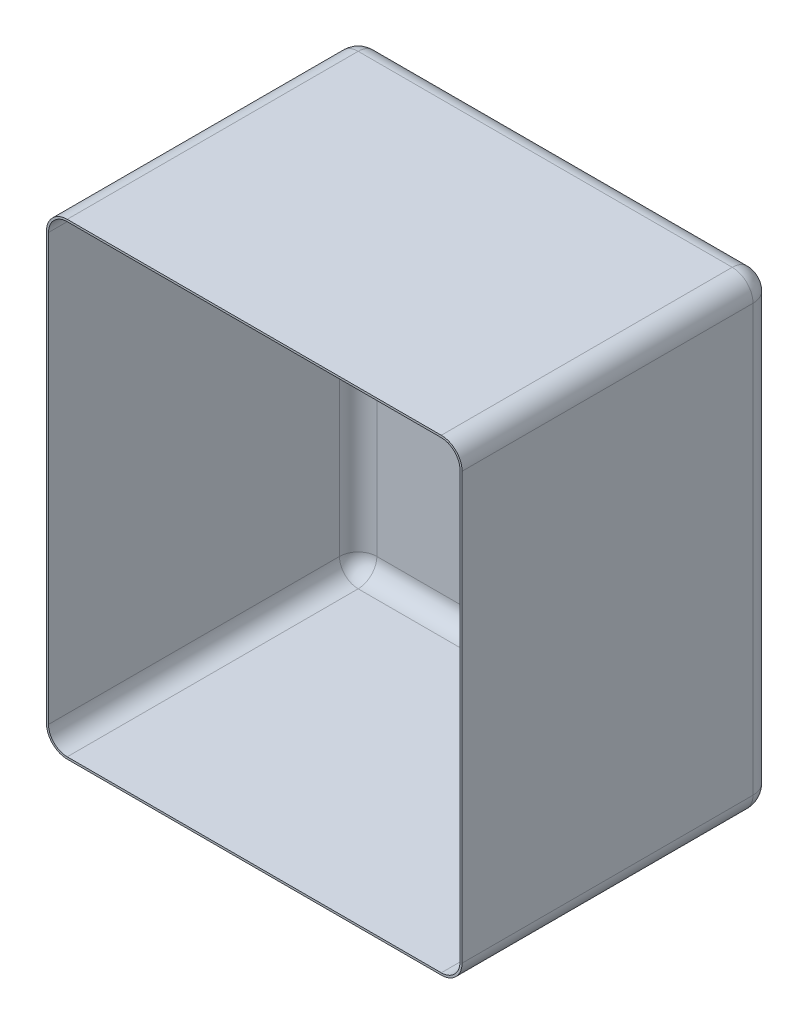
ISO-10303-21;
HEADER;
FILE_DESCRIPTION(('STEP AP214'),'2;1');
FILE_NAME('part.step','',(''),(''),'','','');
FILE_SCHEMA(('AUTOMOTIVE_DESIGN { 1 0 10303 214 1 1 1 1 }'));
ENDSEC;
DATA;
#1=APPLICATION_CONTEXT('core data for automotive mechanical design processes');
#2=APPLICATION_PROTOCOL_DEFINITION('international standard','automotive_design',2000,#1);
#3=PRODUCT_CONTEXT('',#1,'mechanical');
#4=PRODUCT('Part','Part','',(#3));
#5=PRODUCT_RELATED_PRODUCT_CATEGORY('part','',(#4));
#6=PRODUCT_DEFINITION_FORMATION('','',#4);
#7=PRODUCT_DEFINITION_CONTEXT('part definition',#1,'design');
#8=PRODUCT_DEFINITION('design','',#6,#7);
#9=PRODUCT_DEFINITION_SHAPE('','',#8);
#10=(LENGTH_UNIT() NAMED_UNIT(*) SI_UNIT(.MILLI.,.METRE.));
#11=(NAMED_UNIT(*) PLANE_ANGLE_UNIT() SI_UNIT($,.RADIAN.));
#12=(NAMED_UNIT(*) SI_UNIT($,.STERADIAN.) SOLID_ANGLE_UNIT());
#13=UNCERTAINTY_MEASURE_WITH_UNIT(LENGTH_MEASURE(1.E-05),#10,'distance_accuracy_value','');
#14=(GEOMETRIC_REPRESENTATION_CONTEXT(3) GLOBAL_UNCERTAINTY_ASSIGNED_CONTEXT((#13)) GLOBAL_UNIT_ASSIGNED_CONTEXT((#10,
#11,#12)) REPRESENTATION_CONTEXT('',''));
#15=CARTESIAN_POINT('',(0.,0.,0.));
#16=DIRECTION('',(0.,0.,1.));
#17=DIRECTION('',(1.,0.,0.));
#18=AXIS2_PLACEMENT_3D('',#15,#16,#17);
#19=CARTESIAN_POINT('',(200.,225.,300.));
#20=DIRECTION('',(-1.,0.,0.));
#21=DIRECTION('',(0.,-1.,0.));
#22=AXIS2_PLACEMENT_3D('',#19,#20,#21);
#23=PLANE('',#22);
#24=DIRECTION('',(0.,1.,0.));
#25=VECTOR('',#24,1.);
#26=CARTESIAN_POINT('',(200.,225.,20.));
#27=LINE('',#26,#25);
#28=CARTESIAN_POINT('',(200.,-205.,20.));
#29=VERTEX_POINT('',#28);
#30=CARTESIAN_POINT('',(200.,205.,20.));
#31=VERTEX_POINT('',#30);
#32=EDGE_CURVE('E72',#29,#31,#27,.T.);
#33=ORIENTED_EDGE('',*,*,#32,.T.);
#34=DIRECTION('',(0.,0.,-1.));
#35=VECTOR('',#34,1.);
#36=CARTESIAN_POINT('',(200.,205.,300.));
#37=LINE('',#36,#35);
#38=CARTESIAN_POINT('',(200.,205.,300.));
#39=VERTEX_POINT('',#38);
#40=EDGE_CURVE('E296',#31,#39,#37,.F.);
#41=ORIENTED_EDGE('',*,*,#40,.T.);
#42=DIRECTION('',(0.,1.,0.));
#43=VECTOR('',#42,1.);
#44=CARTESIAN_POINT('',(200.,225.,300.));
#45=LINE('',#44,#43);
#46=CARTESIAN_POINT('',(200.,-205.,300.));
#47=VERTEX_POINT('',#46);
#48=EDGE_CURVE('E253',#47,#39,#45,.T.);
#49=ORIENTED_EDGE('',*,*,#48,.F.);
#50=DIRECTION('',(0.,0.,-1.));
#51=VECTOR('',#50,1.);
#52=CARTESIAN_POINT('',(200.,-205.,300.));
#53=LINE('',#52,#51);
#54=EDGE_CURVE('E293',#47,#29,#53,.T.);
#55=ORIENTED_EDGE('',*,*,#54,.T.);
#56=EDGE_LOOP('',(#33,#41,#49,#55));
#57=FACE_BOUND('',#56,.T.);
#58=ADVANCED_FACE('F47',(#57),#23,.F.);
#59=CARTESIAN_POINT('',(-200.,225.,300.));
#60=DIRECTION('',(0.,-1.,0.));
#61=DIRECTION('',(0.,0.,-1.));
#62=AXIS2_PLACEMENT_3D('',#59,#60,#61);
#63=PLANE('',#62);
#64=DIRECTION('',(-1.,0.,0.));
#65=VECTOR('',#64,1.);
#66=CARTESIAN_POINT('',(-200.,225.,20.));
#67=LINE('',#66,#65);
#68=CARTESIAN_POINT('',(180.,225.,20.));
#69=VERTEX_POINT('',#68);
#70=CARTESIAN_POINT('',(-180.,225.,20.));
#71=VERTEX_POINT('',#70);
#72=EDGE_CURVE('E267',#69,#71,#67,.T.);
#73=ORIENTED_EDGE('',*,*,#72,.T.);
#74=DIRECTION('',(0.,0.,-1.));
#75=VECTOR('',#74,1.);
#76=CARTESIAN_POINT('',(-180.,225.,300.));
#77=LINE('',#76,#75);
#78=CARTESIAN_POINT('',(-180.,225.,300.));
#79=VERTEX_POINT('',#78);
#80=EDGE_CURVE('E270',#71,#79,#77,.F.);
#81=ORIENTED_EDGE('',*,*,#80,.T.);
#82=DIRECTION('',(-1.,0.,0.));
#83=VECTOR('',#82,1.);
#84=CARTESIAN_POINT('',(-200.,225.,300.));
#85=LINE('',#84,#83);
#86=CARTESIAN_POINT('',(180.,225.,300.));
#87=VERTEX_POINT('',#86);
#88=EDGE_CURVE('E256',#87,#79,#85,.T.);
#89=ORIENTED_EDGE('',*,*,#88,.F.);
#90=DIRECTION('',(0.,0.,-1.));
#91=VECTOR('',#90,1.);
#92=CARTESIAN_POINT('',(180.,225.,300.));
#93=LINE('',#92,#91);
#94=EDGE_CURVE('E265',#87,#69,#93,.T.);
#95=ORIENTED_EDGE('',*,*,#94,.T.);
#96=EDGE_LOOP('',(#73,#81,#89,#95));
#97=FACE_BOUND('',#96,.T.);
#98=ADVANCED_FACE('F395',(#97),#63,.F.);
#99=CARTESIAN_POINT('',(-200.,225.,300.));
#100=DIRECTION('',(1.,0.,0.));
#101=DIRECTION('',(0.,1.,0.));
#102=AXIS2_PLACEMENT_3D('',#99,#100,#101);
#103=PLANE('',#102);
#104=DIRECTION('',(0.,-1.,0.));
#105=VECTOR('',#104,1.);
#106=CARTESIAN_POINT('',(-200.,225.,300.));
#107=LINE('',#106,#105);
#108=CARTESIAN_POINT('',(-200.,205.,300.));
#109=VERTEX_POINT('',#108);
#110=CARTESIAN_POINT('',(-200.,-205.,300.));
#111=VERTEX_POINT('',#110);
#112=EDGE_CURVE('E259',#109,#111,#107,.T.);
#113=ORIENTED_EDGE('',*,*,#112,.F.);
#114=DIRECTION('',(0.,0.,-1.));
#115=VECTOR('',#114,1.);
#116=CARTESIAN_POINT('',(-200.,205.,300.));
#117=LINE('',#116,#115);
#118=CARTESIAN_POINT('',(-200.,205.,20.));
#119=VERTEX_POINT('',#118);
#120=EDGE_CURVE('E285',#109,#119,#117,.T.);
#121=ORIENTED_EDGE('',*,*,#120,.T.);
#122=DIRECTION('',(0.,-1.,0.));
#123=VECTOR('',#122,1.);
#124=CARTESIAN_POINT('',(-200.,225.,20.));
#125=LINE('',#124,#123);
#126=CARTESIAN_POINT('',(-200.,-205.,20.));
#127=VERTEX_POINT('',#126);
#128=EDGE_CURVE('E283',#119,#127,#125,.T.);
#129=ORIENTED_EDGE('',*,*,#128,.T.);
#130=DIRECTION('',(0.,0.,-1.));
#131=VECTOR('',#130,1.);
#132=CARTESIAN_POINT('',(-200.,-205.,300.));
#133=LINE('',#132,#131);
#134=EDGE_CURVE('E281',#127,#111,#133,.F.);
#135=ORIENTED_EDGE('',*,*,#134,.T.);
#136=EDGE_LOOP('',(#113,#121,#129,#135));
#137=FACE_BOUND('',#136,.T.);
#138=ADVANCED_FACE('F398',(#137),#103,.F.);
#139=CARTESIAN_POINT('',(-200.,-225.,300.));
#140=DIRECTION('',(0.,1.,0.));
#141=DIRECTION('',(0.,0.,1.));
#142=AXIS2_PLACEMENT_3D('',#139,#140,#141);
#143=PLANE('',#142);
#144=DIRECTION('',(1.,0.,0.));
#145=VECTOR('',#144,1.);
#146=CARTESIAN_POINT('',(-200.,-225.,300.));
#147=LINE('',#146,#145);
#148=CARTESIAN_POINT('',(-180.,-225.,300.));
#149=VERTEX_POINT('',#148);
#150=CARTESIAN_POINT('',(180.,-225.,300.));
#151=VERTEX_POINT('',#150);
#152=EDGE_CURVE('E262',#149,#151,#147,.T.);
#153=ORIENTED_EDGE('',*,*,#152,.F.);
#154=DIRECTION('',(0.,0.,-1.));
#155=VECTOR('',#154,1.);
#156=CARTESIAN_POINT('',(-180.,-225.,300.));
#157=LINE('',#156,#155);
#158=CARTESIAN_POINT('',(-180.,-225.,20.));
#159=VERTEX_POINT('',#158);
#160=EDGE_CURVE('E291',#149,#159,#157,.T.);
#161=ORIENTED_EDGE('',*,*,#160,.T.);
#162=DIRECTION('',(1.,0.,0.));
#163=VECTOR('',#162,1.);
#164=CARTESIAN_POINT('',(-200.,-225.,20.));
#165=LINE('',#164,#163);
#166=CARTESIAN_POINT('',(180.,-225.,20.));
#167=VERTEX_POINT('',#166);
#168=EDGE_CURVE('E289',#159,#167,#165,.T.);
#169=ORIENTED_EDGE('',*,*,#168,.T.);
#170=DIRECTION('',(0.,0.,-1.));
#171=VECTOR('',#170,1.);
#172=CARTESIAN_POINT('',(180.,-225.,300.));
#173=LINE('',#172,#171);
#174=EDGE_CURVE('E287',#167,#151,#173,.F.);
#175=ORIENTED_EDGE('',*,*,#174,.T.);
#176=EDGE_LOOP('',(#153,#161,#169,#175));
#177=FACE_BOUND('',#176,.T.);
#178=ADVANCED_FACE('F363',(#177),#143,.F.);
#179=CARTESIAN_POINT('',(0.,0.,300.));
#180=DIRECTION('',(0.,0.,1.));
#181=DIRECTION('',(1.,0.,0.));
#182=AXIS2_PLACEMENT_3D('',#179,#180,#181);
#183=PLANE('',#182);
#184=DIRECTION('',(-1.,0.,0.));
#185=VECTOR('',#184,1.);
#186=CARTESIAN_POINT('',(-200.,223.,300.));
#187=LINE('',#186,#185);
#188=CARTESIAN_POINT('',(180.,223.,300.));
#189=VERTEX_POINT('',#188);
#190=CARTESIAN_POINT('',(-180.,223.,300.));
#191=VERTEX_POINT('',#190);
#192=EDGE_CURVE('E236',#189,#191,#187,.T.);
#193=ORIENTED_EDGE('',*,*,#192,.F.);
#194=CARTESIAN_POINT('',(180.,205.,300.));
#195=DIRECTION('',(0.,0.,1.));
#196=DIRECTION('',(1.,0.,0.));
#197=AXIS2_PLACEMENT_3D('',#194,#195,#196);
#198=CIRCLE('',#197,18.);
#199=CARTESIAN_POINT('',(198.,205.,300.));
#200=VERTEX_POINT('',#199);
#201=EDGE_CURVE('E238',#200,#189,#198,.T.);
#202=ORIENTED_EDGE('',*,*,#201,.F.);
#203=DIRECTION('',(0.,1.,0.));
#204=VECTOR('',#203,1.);
#205=CARTESIAN_POINT('',(198.,225.,300.));
#206=LINE('',#205,#204);
#207=CARTESIAN_POINT('',(198.,-205.,300.));
#208=VERTEX_POINT('',#207);
#209=EDGE_CURVE('E64',#208,#200,#206,.T.);
#210=ORIENTED_EDGE('',*,*,#209,.F.);
#211=CARTESIAN_POINT('',(180.,-205.,300.));
#212=DIRECTION('',(0.,0.,1.));
#213=DIRECTION('',(1.,0.,0.));
#214=AXIS2_PLACEMENT_3D('',#211,#212,#213);
#215=CIRCLE('',#214,18.);
#216=CARTESIAN_POINT('',(180.,-223.,300.));
#217=VERTEX_POINT('',#216);
#218=EDGE_CURVE('E202',#217,#208,#215,.T.);
#219=ORIENTED_EDGE('',*,*,#218,.F.);
#220=DIRECTION('',(1.,0.,0.));
#221=VECTOR('',#220,1.);
#222=CARTESIAN_POINT('',(-200.,-223.,300.));
#223=LINE('',#222,#221);
#224=CARTESIAN_POINT('',(-180.,-223.,300.));
#225=VERTEX_POINT('',#224);
#226=EDGE_CURVE('E224',#225,#217,#223,.T.);
#227=ORIENTED_EDGE('',*,*,#226,.F.);
#228=CARTESIAN_POINT('',(-180.,-205.,300.));
#229=DIRECTION('',(0.,0.,1.));
#230=DIRECTION('',(1.,0.,0.));
#231=AXIS2_PLACEMENT_3D('',#228,#229,#230);
#232=CIRCLE('',#231,18.);
#233=CARTESIAN_POINT('',(-198.,-205.,300.));
#234=VERTEX_POINT('',#233);
#235=EDGE_CURVE('E240',#234,#225,#232,.T.);
#236=ORIENTED_EDGE('',*,*,#235,.F.);
#237=DIRECTION('',(0.,-1.,0.));
#238=VECTOR('',#237,1.);
#239=CARTESIAN_POINT('',(-198.,225.,300.));
#240=LINE('',#239,#238);
#241=CARTESIAN_POINT('',(-198.,205.,300.));
#242=VERTEX_POINT('',#241);
#243=EDGE_CURVE('E243',#242,#234,#240,.T.);
#244=ORIENTED_EDGE('',*,*,#243,.F.);
#245=CARTESIAN_POINT('',(-180.,205.,300.));
#246=DIRECTION('',(0.,0.,1.));
#247=DIRECTION('',(1.,0.,0.));
#248=AXIS2_PLACEMENT_3D('',#245,#246,#247);
#249=CIRCLE('',#248,18.);
#250=EDGE_CURVE('E244',#191,#242,#249,.T.);
#251=ORIENTED_EDGE('',*,*,#250,.F.);
#252=EDGE_LOOP('',(#193,#202,#210,#219,#227,#236,#244,#251));
#253=FACE_BOUND('',#252,.T.);
#254=ORIENTED_EDGE('',*,*,#88,.T.);
#255=CARTESIAN_POINT('',(-180.,205.,300.));
#256=DIRECTION('',(0.,0.,1.));
#257=DIRECTION('',(1.,0.,0.));
#258=AXIS2_PLACEMENT_3D('',#255,#256,#257);
#259=CIRCLE('',#258,20.);
#260=EDGE_CURVE('E11',#79,#109,#259,.T.);
#261=ORIENTED_EDGE('',*,*,#260,.T.);
#262=ORIENTED_EDGE('',*,*,#112,.T.);
#263=CARTESIAN_POINT('',(-180.,-205.,300.));
#264=DIRECTION('',(0.,0.,1.));
#265=DIRECTION('',(1.,0.,0.));
#266=AXIS2_PLACEMENT_3D('',#263,#264,#265);
#267=CIRCLE('',#266,20.);
#268=EDGE_CURVE('E56',#111,#149,#267,.T.);
#269=ORIENTED_EDGE('',*,*,#268,.T.);
#270=ORIENTED_EDGE('',*,*,#152,.T.);
#271=CARTESIAN_POINT('',(180.,-205.,300.));
#272=DIRECTION('',(0.,0.,1.));
#273=DIRECTION('',(1.,0.,0.));
#274=AXIS2_PLACEMENT_3D('',#271,#272,#273);
#275=CIRCLE('',#274,20.);
#276=EDGE_CURVE('E298',#151,#47,#275,.T.);
#277=ORIENTED_EDGE('',*,*,#276,.T.);
#278=ORIENTED_EDGE('',*,*,#48,.T.);
#279=CARTESIAN_POINT('',(180.,205.,300.));
#280=DIRECTION('',(0.,0.,1.));
#281=DIRECTION('',(1.,0.,0.));
#282=AXIS2_PLACEMENT_3D('',#279,#280,#281);
#283=CIRCLE('',#282,20.);
#284=EDGE_CURVE('E300',#39,#87,#283,.T.);
#285=ORIENTED_EDGE('',*,*,#284,.T.);
#286=EDGE_LOOP('',(#254,#261,#262,#269,#270,#277,#278,#285));
#287=FACE_BOUND('',#286,.T.);
#288=ADVANCED_FACE('F356',(#253,#287),#183,.T.);
#289=CARTESIAN_POINT('',(0.,0.,0.));
#290=DIRECTION('',(0.,0.,1.));
#291=DIRECTION('',(1.,0.,0.));
#292=AXIS2_PLACEMENT_3D('',#289,#290,#291);
#293=PLANE('',#292);
#294=DIRECTION('',(0.,-1.,0.));
#295=VECTOR('',#294,1.);
#296=CARTESIAN_POINT('',(-180.,0.,0.));
#297=LINE('',#296,#295);
#298=CARTESIAN_POINT('',(-180.,-205.,0.));
#299=VERTEX_POINT('',#298);
#300=CARTESIAN_POINT('',(-180.,205.,0.));
#301=VERTEX_POINT('',#300);
#302=EDGE_CURVE('E276',#299,#301,#297,.F.);
#303=ORIENTED_EDGE('',*,*,#302,.T.);
#304=DIRECTION('',(-1.,0.,0.));
#305=VECTOR('',#304,1.);
#306=CARTESIAN_POINT('',(0.,205.,0.));
#307=LINE('',#306,#305);
#308=CARTESIAN_POINT('',(180.,205.,0.));
#309=VERTEX_POINT('',#308);
#310=EDGE_CURVE('E278',#301,#309,#307,.F.);
#311=ORIENTED_EDGE('',*,*,#310,.T.);
#312=DIRECTION('',(0.,1.,0.));
#313=VECTOR('',#312,1.);
#314=CARTESIAN_POINT('',(180.,0.,0.));
#315=LINE('',#314,#313);
#316=CARTESIAN_POINT('',(180.,-205.,0.));
#317=VERTEX_POINT('',#316);
#318=EDGE_CURVE('E272',#309,#317,#315,.F.);
#319=ORIENTED_EDGE('',*,*,#318,.T.);
#320=DIRECTION('',(1.,0.,0.));
#321=VECTOR('',#320,1.);
#322=CARTESIAN_POINT('',(0.,-205.,0.));
#323=LINE('',#322,#321);
#324=EDGE_CURVE('E274',#317,#299,#323,.F.);
#325=ORIENTED_EDGE('',*,*,#324,.T.);
#326=EDGE_LOOP('',(#303,#311,#319,#325));
#327=FACE_BOUND('',#326,.T.);
#328=ADVANCED_FACE('F382',(#327),#293,.F.);
#329=CARTESIAN_POINT('',(180.,-205.,300.));
#330=DIRECTION('',(0.,0.,-1.));
#331=DIRECTION('',(-1.,0.,0.));
#332=AXIS2_PLACEMENT_3D('',#329,#330,#331);
#333=CYLINDRICAL_SURFACE('',#332,20.);
#334=ORIENTED_EDGE('',*,*,#276,.F.);
#335=ORIENTED_EDGE('',*,*,#174,.F.);
#336=CARTESIAN_POINT('',(180.,-205.,20.));
#337=DIRECTION('',(0.,0.,-1.));
#338=DIRECTION('',(-1.,0.,0.));
#339=AXIS2_PLACEMENT_3D('',#336,#337,#338);
#340=CIRCLE('',#339,20.);
#341=EDGE_CURVE('E329',#29,#167,#340,.T.);
#342=ORIENTED_EDGE('',*,*,#341,.F.);
#343=ORIENTED_EDGE('',*,*,#54,.F.);
#344=EDGE_LOOP('',(#334,#335,#342,#343));
#345=FACE_BOUND('',#344,.T.);
#346=ADVANCED_FACE('F49',(#345),#333,.T.);
#347=CARTESIAN_POINT('',(-180.,-205.,300.));
#348=DIRECTION('',(0.,0.,-1.));
#349=DIRECTION('',(-1.,0.,0.));
#350=AXIS2_PLACEMENT_3D('',#347,#348,#349);
#351=CYLINDRICAL_SURFACE('',#350,20.);
#352=ORIENTED_EDGE('',*,*,#268,.F.);
#353=ORIENTED_EDGE('',*,*,#134,.F.);
#354=CARTESIAN_POINT('',(-180.,-205.,20.));
#355=DIRECTION('',(0.,0.,-1.));
#356=DIRECTION('',(-1.,0.,0.));
#357=AXIS2_PLACEMENT_3D('',#354,#355,#356);
#358=CIRCLE('',#357,20.);
#359=EDGE_CURVE('E327',#159,#127,#358,.T.);
#360=ORIENTED_EDGE('',*,*,#359,.F.);
#361=ORIENTED_EDGE('',*,*,#160,.F.);
#362=EDGE_LOOP('',(#352,#353,#360,#361));
#363=FACE_BOUND('',#362,.T.);
#364=ADVANCED_FACE('F372',(#363),#351,.T.);
#365=CARTESIAN_POINT('',(-200.,-205.,20.));
#366=DIRECTION('',(1.,0.,0.));
#367=DIRECTION('',(0.,0.,-1.));
#368=AXIS2_PLACEMENT_3D('',#365,#366,#367);
#369=CYLINDRICAL_SURFACE('',#368,20.);
#370=CARTESIAN_POINT('',(180.,-205.,20.));
#371=DIRECTION('',(1.,0.,0.));
#372=DIRECTION('',(0.,0.,-1.));
#373=AXIS2_PLACEMENT_3D('',#370,#371,#372);
#374=CIRCLE('',#373,20.);
#375=EDGE_CURVE('E51',#167,#317,#374,.T.);
#376=ORIENTED_EDGE('',*,*,#375,.F.);
#377=ORIENTED_EDGE('',*,*,#168,.F.);
#378=CARTESIAN_POINT('',(-180.,-205.,20.));
#379=DIRECTION('',(-1.,0.,0.));
#380=DIRECTION('',(0.,0.,1.));
#381=AXIS2_PLACEMENT_3D('',#378,#379,#380);
#382=CIRCLE('',#381,20.);
#383=EDGE_CURVE('E324',#299,#159,#382,.T.);
#384=ORIENTED_EDGE('',*,*,#383,.F.);
#385=ORIENTED_EDGE('',*,*,#324,.F.);
#386=EDGE_LOOP('',(#376,#377,#384,#385));
#387=FACE_BOUND('',#386,.T.);
#388=ADVANCED_FACE('F367',(#387),#369,.T.);
#389=CARTESIAN_POINT('',(180.,-205.,20.));
#390=DIRECTION('',(0.,0.,1.));
#391=DIRECTION('',(1.,0.,0.));
#392=AXIS2_PLACEMENT_3D('',#389,#390,#391);
#393=SPHERICAL_SURFACE('',#392,20.);
#394=ORIENTED_EDGE('',*,*,#341,.T.);
#395=ORIENTED_EDGE('',*,*,#375,.T.);
#396=CARTESIAN_POINT('',(180.,-205.,20.));
#397=DIRECTION('',(0.,-1.,0.));
#398=DIRECTION('',(1.,0.,0.));
#399=AXIS2_PLACEMENT_3D('',#396,#397,#398);
#400=CIRCLE('',#399,20.);
#401=EDGE_CURVE('E321',#29,#317,#400,.F.);
#402=ORIENTED_EDGE('',*,*,#401,.F.);
#403=EDGE_LOOP('',(#394,#395,#402));
#404=FACE_BOUND('',#403,.T.);
#405=ADVANCED_FACE('F336',(#404),#393,.T.);
#406=CARTESIAN_POINT('',(-180.,-205.,20.));
#407=DIRECTION('',(0.,0.,1.));
#408=DIRECTION('',(1.,0.,0.));
#409=AXIS2_PLACEMENT_3D('',#406,#407,#408);
#410=SPHERICAL_SURFACE('',#409,20.);
#411=ORIENTED_EDGE('',*,*,#383,.T.);
#412=ORIENTED_EDGE('',*,*,#359,.T.);
#413=CARTESIAN_POINT('',(-180.,-205.,20.));
#414=DIRECTION('',(0.,-1.,0.));
#415=DIRECTION('',(0.,0.,-1.));
#416=AXIS2_PLACEMENT_3D('',#413,#414,#415);
#417=CIRCLE('',#416,20.);
#418=EDGE_CURVE('E318',#299,#127,#417,.F.);
#419=ORIENTED_EDGE('',*,*,#418,.F.);
#420=EDGE_LOOP('',(#411,#412,#419));
#421=FACE_BOUND('',#420,.T.);
#422=ADVANCED_FACE('F374',(#421),#410,.T.);
#423=CARTESIAN_POINT('',(180.,225.,20.));
#424=DIRECTION('',(0.,1.,0.));
#425=DIRECTION('',(-1.,0.,0.));
#426=AXIS2_PLACEMENT_3D('',#423,#424,#425);
#427=CYLINDRICAL_SURFACE('',#426,20.);
#428=ORIENTED_EDGE('',*,*,#401,.T.);
#429=ORIENTED_EDGE('',*,*,#318,.F.);
#430=CARTESIAN_POINT('',(180.,205.,20.));
#431=DIRECTION('',(0.,1.,0.));
#432=DIRECTION('',(0.,0.,1.));
#433=AXIS2_PLACEMENT_3D('',#430,#431,#432);
#434=CIRCLE('',#433,20.);
#435=EDGE_CURVE('E315',#31,#309,#434,.T.);
#436=ORIENTED_EDGE('',*,*,#435,.F.);
#437=ORIENTED_EDGE('',*,*,#32,.F.);
#438=EDGE_LOOP('',(#428,#429,#436,#437));
#439=FACE_BOUND('',#438,.T.);
#440=ADVANCED_FACE('F342',(#439),#427,.T.);
#441=CARTESIAN_POINT('',(180.,205.,300.));
#442=DIRECTION('',(0.,0.,-1.));
#443=DIRECTION('',(-1.,0.,0.));
#444=AXIS2_PLACEMENT_3D('',#441,#442,#443);
#445=CYLINDRICAL_SURFACE('',#444,20.);
#446=ORIENTED_EDGE('',*,*,#284,.F.);
#447=ORIENTED_EDGE('',*,*,#40,.F.);
#448=CARTESIAN_POINT('',(180.,205.,20.));
#449=DIRECTION('',(0.,0.,-1.));
#450=DIRECTION('',(-1.,0.,0.));
#451=AXIS2_PLACEMENT_3D('',#448,#449,#450);
#452=CIRCLE('',#451,20.);
#453=EDGE_CURVE('E312',#69,#31,#452,.T.);
#454=ORIENTED_EDGE('',*,*,#453,.F.);
#455=ORIENTED_EDGE('',*,*,#94,.F.);
#456=EDGE_LOOP('',(#446,#447,#454,#455));
#457=FACE_BOUND('',#456,.T.);
#458=ADVANCED_FACE('F352',(#457),#445,.T.);
#459=CARTESIAN_POINT('',(-180.,205.,300.));
#460=DIRECTION('',(0.,0.,-1.));
#461=DIRECTION('',(-1.,0.,0.));
#462=AXIS2_PLACEMENT_3D('',#459,#460,#461);
#463=CYLINDRICAL_SURFACE('',#462,20.);
#464=ORIENTED_EDGE('',*,*,#260,.F.);
#465=ORIENTED_EDGE('',*,*,#80,.F.);
#466=CARTESIAN_POINT('',(-180.,205.,20.));
#467=DIRECTION('',(0.,0.,-1.));
#468=DIRECTION('',(-1.,0.,0.));
#469=AXIS2_PLACEMENT_3D('',#466,#467,#468);
#470=CIRCLE('',#469,20.);
#471=EDGE_CURVE('E309',#119,#71,#470,.T.);
#472=ORIENTED_EDGE('',*,*,#471,.F.);
#473=ORIENTED_EDGE('',*,*,#120,.F.);
#474=EDGE_LOOP('',(#464,#465,#472,#473));
#475=FACE_BOUND('',#474,.T.);
#476=ADVANCED_FACE('F393',(#475),#463,.T.);
#477=CARTESIAN_POINT('',(-180.,225.,20.));
#478=DIRECTION('',(0.,-1.,0.));
#479=DIRECTION('',(1.,0.,0.));
#480=AXIS2_PLACEMENT_3D('',#477,#478,#479);
#481=CYLINDRICAL_SURFACE('',#480,20.);
#482=ORIENTED_EDGE('',*,*,#418,.T.);
#483=ORIENTED_EDGE('',*,*,#128,.F.);
#484=CARTESIAN_POINT('',(-180.,205.,20.));
#485=DIRECTION('',(0.,1.,0.));
#486=DIRECTION('',(0.,0.,1.));
#487=AXIS2_PLACEMENT_3D('',#484,#485,#486);
#488=CIRCLE('',#487,20.);
#489=EDGE_CURVE('E306',#301,#119,#488,.T.);
#490=ORIENTED_EDGE('',*,*,#489,.F.);
#491=ORIENTED_EDGE('',*,*,#302,.F.);
#492=EDGE_LOOP('',(#482,#483,#490,#491));
#493=FACE_BOUND('',#492,.T.);
#494=ADVANCED_FACE('F379',(#493),#481,.T.);
#495=CARTESIAN_POINT('',(180.,205.,20.));
#496=DIRECTION('',(0.,0.,1.));
#497=DIRECTION('',(1.,0.,0.));
#498=AXIS2_PLACEMENT_3D('',#495,#496,#497);
#499=SPHERICAL_SURFACE('',#498,20.);
#500=ORIENTED_EDGE('',*,*,#453,.T.);
#501=ORIENTED_EDGE('',*,*,#435,.T.);
#502=CARTESIAN_POINT('',(180.,205.,20.));
#503=DIRECTION('',(1.,0.,0.));
#504=DIRECTION('',(0.,1.,0.));
#505=AXIS2_PLACEMENT_3D('',#502,#503,#504);
#506=CIRCLE('',#505,20.);
#507=EDGE_CURVE('E304',#69,#309,#506,.F.);
#508=ORIENTED_EDGE('',*,*,#507,.F.);
#509=EDGE_LOOP('',(#500,#501,#508));
#510=FACE_BOUND('',#509,.T.);
#511=ADVANCED_FACE('F347',(#510),#499,.T.);
#512=CARTESIAN_POINT('',(-180.,205.,20.));
#513=DIRECTION('',(0.,0.,1.));
#514=DIRECTION('',(1.,0.,0.));
#515=AXIS2_PLACEMENT_3D('',#512,#513,#514);
#516=SPHERICAL_SURFACE('',#515,20.);
#517=ORIENTED_EDGE('',*,*,#489,.T.);
#518=ORIENTED_EDGE('',*,*,#471,.T.);
#519=CARTESIAN_POINT('',(-180.,205.,20.));
#520=DIRECTION('',(-1.,0.,0.));
#521=DIRECTION('',(0.,0.,1.));
#522=AXIS2_PLACEMENT_3D('',#519,#520,#521);
#523=CIRCLE('',#522,20.);
#524=EDGE_CURVE('E246',#301,#71,#523,.F.);
#525=ORIENTED_EDGE('',*,*,#524,.F.);
#526=EDGE_LOOP('',(#517,#518,#525));
#527=FACE_BOUND('',#526,.T.);
#528=ADVANCED_FACE('F387',(#527),#516,.T.);
#529=CARTESIAN_POINT('',(-200.,205.,20.));
#530=DIRECTION('',(-1.,0.,0.));
#531=DIRECTION('',(0.,0.,1.));
#532=AXIS2_PLACEMENT_3D('',#529,#530,#531);
#533=CYLINDRICAL_SURFACE('',#532,20.);
#534=ORIENTED_EDGE('',*,*,#507,.T.);
#535=ORIENTED_EDGE('',*,*,#310,.F.);
#536=ORIENTED_EDGE('',*,*,#524,.T.);
#537=ORIENTED_EDGE('',*,*,#72,.F.);
#538=EDGE_LOOP('',(#534,#535,#536,#537));
#539=FACE_BOUND('',#538,.T.);
#540=ADVANCED_FACE('F385',(#539),#533,.T.);
#541=CARTESIAN_POINT('',(198.,225.,300.));
#542=DIRECTION('',(-1.,0.,0.));
#543=DIRECTION('',(0.,-1.,0.));
#544=AXIS2_PLACEMENT_3D('',#541,#542,#543);
#545=PLANE('',#544);
#546=DIRECTION('',(0.,-1.,0.));
#547=VECTOR('',#546,1.);
#548=CARTESIAN_POINT('',(198.,225.,20.));
#549=LINE('',#548,#547);
#550=CARTESIAN_POINT('',(198.,-205.,20.));
#551=VERTEX_POINT('',#550);
#552=CARTESIAN_POINT('',(198.,205.,20.));
#553=VERTEX_POINT('',#552);
#554=EDGE_CURVE('E188',#551,#553,#549,.F.);
#555=ORIENTED_EDGE('',*,*,#554,.F.);
#556=DIRECTION('',(0.,0.,1.));
#557=VECTOR('',#556,1.);
#558=CARTESIAN_POINT('',(198.,-205.,300.));
#559=LINE('',#558,#557);
#560=EDGE_CURVE('E196',#208,#551,#559,.F.);
#561=ORIENTED_EDGE('',*,*,#560,.F.);
#562=ORIENTED_EDGE('',*,*,#209,.T.);
#563=DIRECTION('',(0.,0.,1.));
#564=VECTOR('',#563,1.);
#565=CARTESIAN_POINT('',(198.,205.,300.));
#566=LINE('',#565,#564);
#567=EDGE_CURVE('E195',#553,#200,#566,.T.);
#568=ORIENTED_EDGE('',*,*,#567,.F.);
#569=EDGE_LOOP('',(#555,#561,#562,#568));
#570=FACE_BOUND('',#569,.T.);
#571=ADVANCED_FACE('F198',(#570),#545,.T.);
#572=CARTESIAN_POINT('',(-200.,223.,300.));
#573=DIRECTION('',(0.,-1.,0.));
#574=DIRECTION('',(0.,0.,-1.));
#575=AXIS2_PLACEMENT_3D('',#572,#573,#574);
#576=PLANE('',#575);
#577=DIRECTION('',(1.,0.,0.));
#578=VECTOR('',#577,1.);
#579=CARTESIAN_POINT('',(-200.,223.,20.));
#580=LINE('',#579,#578);
#581=CARTESIAN_POINT('',(180.,223.,20.));
#582=VERTEX_POINT('',#581);
#583=CARTESIAN_POINT('',(-180.,223.,20.));
#584=VERTEX_POINT('',#583);
#585=EDGE_CURVE('E223',#582,#584,#580,.F.);
#586=ORIENTED_EDGE('',*,*,#585,.F.);
#587=DIRECTION('',(0.,0.,-1.));
#588=VECTOR('',#587,1.);
#589=CARTESIAN_POINT('',(180.,223.,300.));
#590=LINE('',#589,#588);
#591=EDGE_CURVE('E214',#189,#582,#590,.T.);
#592=ORIENTED_EDGE('',*,*,#591,.F.);
#593=ORIENTED_EDGE('',*,*,#192,.T.);
#594=DIRECTION('',(0.,0.,-1.));
#595=VECTOR('',#594,1.);
#596=CARTESIAN_POINT('',(-180.,223.,300.));
#597=LINE('',#596,#595);
#598=EDGE_CURVE('E227',#584,#191,#597,.F.);
#599=ORIENTED_EDGE('',*,*,#598,.F.);
#600=EDGE_LOOP('',(#586,#592,#593,#599));
#601=FACE_BOUND('',#600,.T.);
#602=ADVANCED_FACE('F498',(#601),#576,.T.);
#603=CARTESIAN_POINT('',(-198.,225.,300.));
#604=DIRECTION('',(1.,0.,0.));
#605=DIRECTION('',(0.,1.,0.));
#606=AXIS2_PLACEMENT_3D('',#603,#604,#605);
#607=PLANE('',#606);
#608=ORIENTED_EDGE('',*,*,#243,.T.);
#609=DIRECTION('',(0.,0.,1.));
#610=VECTOR('',#609,1.);
#611=CARTESIAN_POINT('',(-198.,-205.,300.));
#612=LINE('',#611,#610);
#613=CARTESIAN_POINT('',(-198.,-205.,20.));
#614=VERTEX_POINT('',#613);
#615=EDGE_CURVE('E732',#614,#234,#612,.T.);
#616=ORIENTED_EDGE('',*,*,#615,.F.);
#617=DIRECTION('',(0.,1.,0.));
#618=VECTOR('',#617,1.);
#619=CARTESIAN_POINT('',(-198.,225.,20.));
#620=LINE('',#619,#618);
#621=CARTESIAN_POINT('',(-198.,205.,20.));
#622=VERTEX_POINT('',#621);
#623=EDGE_CURVE('E735',#622,#614,#620,.F.);
#624=ORIENTED_EDGE('',*,*,#623,.F.);
#625=DIRECTION('',(0.,0.,1.));
#626=VECTOR('',#625,1.);
#627=CARTESIAN_POINT('',(-198.,205.,300.));
#628=LINE('',#627,#626);
#629=EDGE_CURVE('E757',#242,#622,#628,.F.);
#630=ORIENTED_EDGE('',*,*,#629,.F.);
#631=EDGE_LOOP('',(#608,#616,#624,#630));
#632=FACE_BOUND('',#631,.T.);
#633=ADVANCED_FACE('F494',(#632),#607,.T.);
#634=CARTESIAN_POINT('',(-200.,-223.,300.));
#635=DIRECTION('',(0.,1.,0.));
#636=DIRECTION('',(0.,0.,1.));
#637=AXIS2_PLACEMENT_3D('',#634,#635,#636);
#638=PLANE('',#637);
#639=ORIENTED_EDGE('',*,*,#226,.T.);
#640=DIRECTION('',(0.,0.,1.));
#641=VECTOR('',#640,1.);
#642=CARTESIAN_POINT('',(180.,-223.,300.));
#643=LINE('',#642,#641);
#644=CARTESIAN_POINT('',(180.,-223.,20.));
#645=VERTEX_POINT('',#644);
#646=EDGE_CURVE('E759',#645,#217,#643,.T.);
#647=ORIENTED_EDGE('',*,*,#646,.F.);
#648=DIRECTION('',(1.,0.,0.));
#649=VECTOR('',#648,1.);
#650=CARTESIAN_POINT('',(-200.,-223.,20.));
#651=LINE('',#650,#649);
#652=CARTESIAN_POINT('',(-180.,-223.,20.));
#653=VERTEX_POINT('',#652);
#654=EDGE_CURVE('E762',#653,#645,#651,.T.);
#655=ORIENTED_EDGE('',*,*,#654,.F.);
#656=DIRECTION('',(0.,0.,1.));
#657=VECTOR('',#656,1.);
#658=CARTESIAN_POINT('',(-180.,-223.,300.));
#659=LINE('',#658,#657);
#660=EDGE_CURVE('E764',#225,#653,#659,.F.);
#661=ORIENTED_EDGE('',*,*,#660,.F.);
#662=EDGE_LOOP('',(#639,#647,#655,#661));
#663=FACE_BOUND('',#662,.T.);
#664=ADVANCED_FACE('F490',(#663),#638,.T.);
#665=CARTESIAN_POINT('',(0.,0.,2.));
#666=DIRECTION('',(0.,0.,1.));
#667=DIRECTION('',(1.,0.,0.));
#668=AXIS2_PLACEMENT_3D('',#665,#666,#667);
#669=PLANE('',#668);
#670=DIRECTION('',(0.,1.,0.));
#671=VECTOR('',#670,1.);
#672=CARTESIAN_POINT('',(-180.,0.,2.));
#673=LINE('',#672,#671);
#674=CARTESIAN_POINT('',(-180.,-205.,2.));
#675=VERTEX_POINT('',#674);
#676=CARTESIAN_POINT('',(-180.,205.,2.));
#677=VERTEX_POINT('',#676);
#678=EDGE_CURVE('E733',#675,#677,#673,.T.);
#679=ORIENTED_EDGE('',*,*,#678,.F.);
#680=DIRECTION('',(1.,0.,0.));
#681=VECTOR('',#680,1.);
#682=CARTESIAN_POINT('',(0.,-205.,2.));
#683=LINE('',#682,#681);
#684=CARTESIAN_POINT('',(180.,-205.,2.));
#685=VERTEX_POINT('',#684);
#686=EDGE_CURVE('E737',#685,#675,#683,.F.);
#687=ORIENTED_EDGE('',*,*,#686,.F.);
#688=DIRECTION('',(0.,1.,0.));
#689=VECTOR('',#688,1.);
#690=CARTESIAN_POINT('',(180.,0.,2.));
#691=LINE('',#690,#689);
#692=CARTESIAN_POINT('',(180.,205.,2.00000000000002));
#693=VERTEX_POINT('',#692);
#694=EDGE_CURVE('E228',#693,#685,#691,.F.);
#695=ORIENTED_EDGE('',*,*,#694,.F.);
#696=DIRECTION('',(1.,0.,0.));
#697=VECTOR('',#696,1.);
#698=CARTESIAN_POINT('',(0.,205.,2.));
#699=LINE('',#698,#697);
#700=EDGE_CURVE('E730',#677,#693,#699,.T.);
#701=ORIENTED_EDGE('',*,*,#700,.F.);
#702=EDGE_LOOP('',(#679,#687,#695,#701));
#703=FACE_BOUND('',#702,.T.);
#704=ADVANCED_FACE('F486',(#703),#669,.T.);
#705=CARTESIAN_POINT('',(180.,-205.,300.));
#706=DIRECTION('',(0.,0.,-1.));
#707=DIRECTION('',(-1.,0.,0.));
#708=AXIS2_PLACEMENT_3D('',#705,#706,#707);
#709=CYLINDRICAL_SURFACE('',#708,18.);
#710=ORIENTED_EDGE('',*,*,#218,.T.);
#711=ORIENTED_EDGE('',*,*,#560,.T.);
#712=CARTESIAN_POINT('',(180.,-205.,20.));
#713=DIRECTION('',(0.,0.,1.));
#714=DIRECTION('',(1.,0.,0.));
#715=AXIS2_PLACEMENT_3D('',#712,#713,#714);
#716=CIRCLE('',#715,18.);
#717=EDGE_CURVE('E744',#551,#645,#716,.F.);
#718=ORIENTED_EDGE('',*,*,#717,.T.);
#719=ORIENTED_EDGE('',*,*,#646,.T.);
#720=EDGE_LOOP('',(#710,#711,#718,#719));
#721=FACE_BOUND('',#720,.T.);
#722=ADVANCED_FACE('F482',(#721),#709,.F.);
#723=CARTESIAN_POINT('',(-180.,-205.,300.));
#724=DIRECTION('',(0.,0.,-1.));
#725=DIRECTION('',(-1.,0.,0.));
#726=AXIS2_PLACEMENT_3D('',#723,#724,#725);
#727=CYLINDRICAL_SURFACE('',#726,18.);
#728=ORIENTED_EDGE('',*,*,#235,.T.);
#729=ORIENTED_EDGE('',*,*,#660,.T.);
#730=CARTESIAN_POINT('',(-180.,-205.,20.));
#731=DIRECTION('',(0.,0.,1.));
#732=DIRECTION('',(1.,0.,0.));
#733=AXIS2_PLACEMENT_3D('',#730,#731,#732);
#734=CIRCLE('',#733,18.);
#735=EDGE_CURVE('E749',#653,#614,#734,.F.);
#736=ORIENTED_EDGE('',*,*,#735,.T.);
#737=ORIENTED_EDGE('',*,*,#615,.T.);
#738=EDGE_LOOP('',(#728,#729,#736,#737));
#739=FACE_BOUND('',#738,.T.);
#740=ADVANCED_FACE('F478',(#739),#727,.F.);
#741=CARTESIAN_POINT('',(-200.,-205.,20.));
#742=DIRECTION('',(1.,0.,0.));
#743=DIRECTION('',(0.,0.,-1.));
#744=AXIS2_PLACEMENT_3D('',#741,#742,#743);
#745=CYLINDRICAL_SURFACE('',#744,18.);
#746=CARTESIAN_POINT('',(180.,-205.,20.));
#747=DIRECTION('',(-1.,0.,0.));
#748=DIRECTION('',(0.,-1.,0.));
#749=AXIS2_PLACEMENT_3D('',#746,#747,#748);
#750=CIRCLE('',#749,18.);
#751=EDGE_CURVE('E237',#645,#685,#750,.F.);
#752=ORIENTED_EDGE('',*,*,#751,.T.);
#753=ORIENTED_EDGE('',*,*,#686,.T.);
#754=CARTESIAN_POINT('',(-180.,-205.,20.));
#755=DIRECTION('',(-1.,0.,0.));
#756=DIRECTION('',(0.,-1.,0.));
#757=AXIS2_PLACEMENT_3D('',#754,#755,#756);
#758=CIRCLE('',#757,18.);
#759=EDGE_CURVE('E745',#675,#653,#758,.T.);
#760=ORIENTED_EDGE('',*,*,#759,.T.);
#761=ORIENTED_EDGE('',*,*,#654,.T.);
#762=EDGE_LOOP('',(#752,#753,#760,#761));
#763=FACE_BOUND('',#762,.T.);
#764=ADVANCED_FACE('F474',(#763),#745,.F.);
#765=CARTESIAN_POINT('',(180.,-205.,20.));
#766=DIRECTION('',(0.,0.,1.));
#767=DIRECTION('',(1.,0.,0.));
#768=AXIS2_PLACEMENT_3D('',#765,#766,#767);
#769=SPHERICAL_SURFACE('',#768,18.);
#770=ORIENTED_EDGE('',*,*,#717,.F.);
#771=CARTESIAN_POINT('',(180.,-205.,20.));
#772=DIRECTION('',(0.,1.,0.));
#773=DIRECTION('',(-1.,0.,0.));
#774=AXIS2_PLACEMENT_3D('',#771,#772,#773);
#775=CIRCLE('',#774,18.);
#776=EDGE_CURVE('E194',#551,#685,#775,.T.);
#777=ORIENTED_EDGE('',*,*,#776,.T.);
#778=ORIENTED_EDGE('',*,*,#751,.F.);
#779=EDGE_LOOP('',(#770,#777,#778));
#780=FACE_BOUND('',#779,.T.);
#781=ADVANCED_FACE('F470',(#780),#769,.F.);
#782=CARTESIAN_POINT('',(-180.,-205.,20.));
#783=DIRECTION('',(0.,0.,1.));
#784=DIRECTION('',(1.,0.,0.));
#785=AXIS2_PLACEMENT_3D('',#782,#783,#784);
#786=SPHERICAL_SURFACE('',#785,18.);
#787=ORIENTED_EDGE('',*,*,#759,.F.);
#788=CARTESIAN_POINT('',(-180.,-205.,20.));
#789=DIRECTION('',(0.,-1.,0.));
#790=DIRECTION('',(1.,0.,0.));
#791=AXIS2_PLACEMENT_3D('',#788,#789,#790);
#792=CIRCLE('',#791,18.);
#793=EDGE_CURVE('E210',#675,#614,#792,.F.);
#794=ORIENTED_EDGE('',*,*,#793,.T.);
#795=ORIENTED_EDGE('',*,*,#735,.F.);
#796=EDGE_LOOP('',(#787,#794,#795));
#797=FACE_BOUND('',#796,.T.);
#798=ADVANCED_FACE('F467',(#797),#786,.F.);
#799=CARTESIAN_POINT('',(180.,225.,20.));
#800=DIRECTION('',(0.,1.,0.));
#801=DIRECTION('',(-1.,0.,0.));
#802=AXIS2_PLACEMENT_3D('',#799,#800,#801);
#803=CYLINDRICAL_SURFACE('',#802,18.);
#804=ORIENTED_EDGE('',*,*,#776,.F.);
#805=ORIENTED_EDGE('',*,*,#554,.T.);
#806=CARTESIAN_POINT('',(180.,205.,20.));
#807=DIRECTION('',(0.,-1.,0.));
#808=DIRECTION('',(0.,0.,-1.));
#809=AXIS2_PLACEMENT_3D('',#806,#807,#808);
#810=CIRCLE('',#809,18.);
#811=EDGE_CURVE('E191',#553,#693,#810,.F.);
#812=ORIENTED_EDGE('',*,*,#811,.T.);
#813=ORIENTED_EDGE('',*,*,#694,.T.);
#814=EDGE_LOOP('',(#804,#805,#812,#813));
#815=FACE_BOUND('',#814,.T.);
#816=ADVANCED_FACE('F189',(#815),#803,.F.);
#817=CARTESIAN_POINT('',(180.,205.,300.));
#818=DIRECTION('',(0.,0.,-1.));
#819=DIRECTION('',(-1.,0.,0.));
#820=AXIS2_PLACEMENT_3D('',#817,#818,#819);
#821=CYLINDRICAL_SURFACE('',#820,18.);
#822=ORIENTED_EDGE('',*,*,#201,.T.);
#823=ORIENTED_EDGE('',*,*,#591,.T.);
#824=CARTESIAN_POINT('',(180.,205.,20.));
#825=DIRECTION('',(0.,0.,1.));
#826=DIRECTION('',(1.,0.,0.));
#827=AXIS2_PLACEMENT_3D('',#824,#825,#826);
#828=CIRCLE('',#827,18.);
#829=EDGE_CURVE('E207',#582,#553,#828,.F.);
#830=ORIENTED_EDGE('',*,*,#829,.T.);
#831=ORIENTED_EDGE('',*,*,#567,.T.);
#832=EDGE_LOOP('',(#822,#823,#830,#831));
#833=FACE_BOUND('',#832,.T.);
#834=ADVANCED_FACE('F212',(#833),#821,.F.);
#835=CARTESIAN_POINT('',(-180.,205.,300.));
#836=DIRECTION('',(0.,0.,-1.));
#837=DIRECTION('',(-1.,0.,0.));
#838=AXIS2_PLACEMENT_3D('',#835,#836,#837);
#839=CYLINDRICAL_SURFACE('',#838,18.);
#840=ORIENTED_EDGE('',*,*,#250,.T.);
#841=ORIENTED_EDGE('',*,*,#629,.T.);
#842=CARTESIAN_POINT('',(-180.,205.,20.));
#843=DIRECTION('',(0.,0.,1.));
#844=DIRECTION('',(1.,0.,0.));
#845=AXIS2_PLACEMENT_3D('',#842,#843,#844);
#846=CIRCLE('',#845,18.);
#847=EDGE_CURVE('E215',#622,#584,#846,.F.);
#848=ORIENTED_EDGE('',*,*,#847,.T.);
#849=ORIENTED_EDGE('',*,*,#598,.T.);
#850=EDGE_LOOP('',(#840,#841,#848,#849));
#851=FACE_BOUND('',#850,.T.);
#852=ADVANCED_FACE('F458',(#851),#839,.F.);
#853=CARTESIAN_POINT('',(-180.,225.,20.));
#854=DIRECTION('',(0.,-1.,0.));
#855=DIRECTION('',(1.,0.,0.));
#856=AXIS2_PLACEMENT_3D('',#853,#854,#855);
#857=CYLINDRICAL_SURFACE('',#856,18.);
#858=ORIENTED_EDGE('',*,*,#793,.F.);
#859=ORIENTED_EDGE('',*,*,#678,.T.);
#860=CARTESIAN_POINT('',(-180.,205.,20.));
#861=DIRECTION('',(0.,1.,0.));
#862=DIRECTION('',(-1.,0.,0.));
#863=AXIS2_PLACEMENT_3D('',#860,#861,#862);
#864=CIRCLE('',#863,18.);
#865=EDGE_CURVE('E218',#677,#622,#864,.T.);
#866=ORIENTED_EDGE('',*,*,#865,.T.);
#867=ORIENTED_EDGE('',*,*,#623,.T.);
#868=EDGE_LOOP('',(#858,#859,#866,#867));
#869=FACE_BOUND('',#868,.T.);
#870=ADVANCED_FACE('F455',(#869),#857,.F.);
#871=CARTESIAN_POINT('',(180.,205.,20.));
#872=DIRECTION('',(0.,0.,1.));
#873=DIRECTION('',(1.,0.,0.));
#874=AXIS2_PLACEMENT_3D('',#871,#872,#873);
#875=SPHERICAL_SURFACE('',#874,18.);
#876=ORIENTED_EDGE('',*,*,#829,.F.);
#877=CARTESIAN_POINT('',(180.,205.,20.));
#878=DIRECTION('',(-1.,0.,0.));
#879=DIRECTION('',(0.,0.,1.));
#880=AXIS2_PLACEMENT_3D('',#877,#878,#879);
#881=CIRCLE('',#880,18.);
#882=EDGE_CURVE('E209',#582,#693,#881,.T.);
#883=ORIENTED_EDGE('',*,*,#882,.T.);
#884=ORIENTED_EDGE('',*,*,#811,.F.);
#885=EDGE_LOOP('',(#876,#883,#884));
#886=FACE_BOUND('',#885,.T.);
#887=ADVANCED_FACE('F206',(#886),#875,.F.);
#888=CARTESIAN_POINT('',(-180.,205.,20.));
#889=DIRECTION('',(0.,0.,1.));
#890=DIRECTION('',(1.,0.,0.));
#891=AXIS2_PLACEMENT_3D('',#888,#889,#890);
#892=SPHERICAL_SURFACE('',#891,18.);
#893=ORIENTED_EDGE('',*,*,#865,.F.);
#894=CARTESIAN_POINT('',(-180.,205.,20.));
#895=DIRECTION('',(-1.,0.,0.));
#896=DIRECTION('',(0.,0.,1.));
#897=AXIS2_PLACEMENT_3D('',#894,#895,#896);
#898=CIRCLE('',#897,18.);
#899=EDGE_CURVE('E232',#677,#584,#898,.F.);
#900=ORIENTED_EDGE('',*,*,#899,.T.);
#901=ORIENTED_EDGE('',*,*,#847,.F.);
#902=EDGE_LOOP('',(#893,#900,#901));
#903=FACE_BOUND('',#902,.T.);
#904=ADVANCED_FACE('F448',(#903),#892,.F.);
#905=CARTESIAN_POINT('',(-200.,205.,20.));
#906=DIRECTION('',(-1.,0.,0.));
#907=DIRECTION('',(0.,0.,1.));
#908=AXIS2_PLACEMENT_3D('',#905,#906,#907);
#909=CYLINDRICAL_SURFACE('',#908,18.);
#910=ORIENTED_EDGE('',*,*,#882,.F.);
#911=ORIENTED_EDGE('',*,*,#585,.T.);
#912=ORIENTED_EDGE('',*,*,#899,.F.);
#913=ORIENTED_EDGE('',*,*,#700,.T.);
#914=EDGE_LOOP('',(#910,#911,#912,#913));
#915=FACE_BOUND('',#914,.T.);
#916=ADVANCED_FACE('F445',(#915),#909,.F.);
#917=CLOSED_SHELL('',(#58,#98,#138,#178,#288,#328,#346,#364,#388,#405,#422,#440,#458,#476,#494,
#511,#528,#540,#571,#602,#633,#664,#704,#722,#740,#764,#781,#798,#816,#834,#852,#870,#887,#904,#916));
#918=MANIFOLD_SOLID_BREP('B2',#917);
#919=ADVANCED_BREP_SHAPE_REPRESENTATION('',(#18,#918),#14);
#920=SHAPE_DEFINITION_REPRESENTATION(#9,#919);
ENDSEC;
END-ISO-10303-21;
